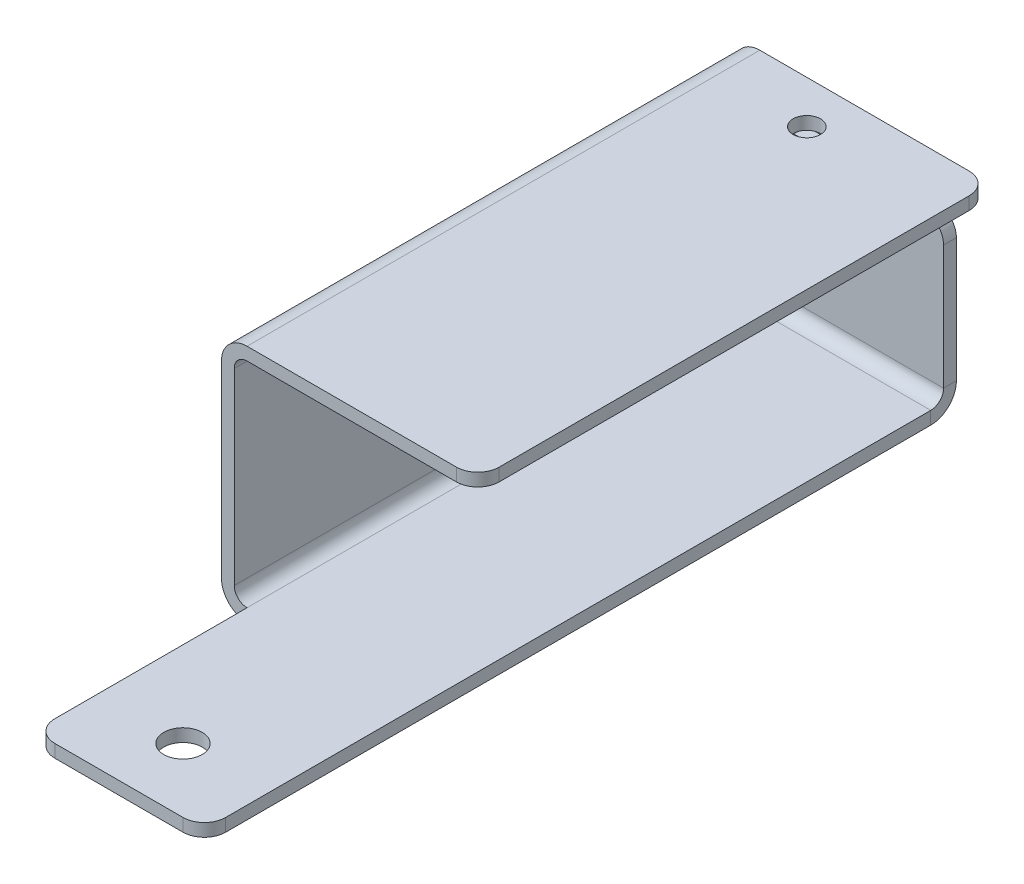
ISO-10303-21;
HEADER;
FILE_DESCRIPTION(('STEP AP214'),'2;1');
FILE_NAME('part.step','',(''),(''),'','','');
FILE_SCHEMA(('AUTOMOTIVE_DESIGN { 1 0 10303 214 1 1 1 1 }'));
ENDSEC;
DATA;
#1=APPLICATION_CONTEXT('core data for automotive mechanical design processes');
#2=APPLICATION_PROTOCOL_DEFINITION('international standard','automotive_design',2000,#1);
#3=PRODUCT_CONTEXT('',#1,'mechanical');
#4=PRODUCT('Part','Part','',(#3));
#5=PRODUCT_RELATED_PRODUCT_CATEGORY('part','',(#4));
#6=PRODUCT_DEFINITION_FORMATION('','',#4);
#7=PRODUCT_DEFINITION_CONTEXT('part definition',#1,'design');
#8=PRODUCT_DEFINITION('design','',#6,#7);
#9=PRODUCT_DEFINITION_SHAPE('','',#8);
#10=(LENGTH_UNIT() NAMED_UNIT(*) SI_UNIT(.MILLI.,.METRE.));
#11=(NAMED_UNIT(*) PLANE_ANGLE_UNIT() SI_UNIT($,.RADIAN.));
#12=(NAMED_UNIT(*) SI_UNIT($,.STERADIAN.) SOLID_ANGLE_UNIT());
#13=UNCERTAINTY_MEASURE_WITH_UNIT(LENGTH_MEASURE(1.E-05),#10,'distance_accuracy_value','');
#14=(GEOMETRIC_REPRESENTATION_CONTEXT(3) GLOBAL_UNCERTAINTY_ASSIGNED_CONTEXT((#13)) GLOBAL_UNIT_ASSIGNED_CONTEXT((#10,
#11,#12)) REPRESENTATION_CONTEXT('',''));
#15=CARTESIAN_POINT('',(0.,0.,0.));
#16=DIRECTION('',(0.,0.,1.));
#17=DIRECTION('',(1.,0.,0.));
#18=AXIS2_PLACEMENT_3D('',#15,#16,#17);
#19=CARTESIAN_POINT('',(-13.,0.,-42.5));
#20=DIRECTION('',(0.,0.,1.));
#21=DIRECTION('',(1.,0.,0.));
#22=AXIS2_PLACEMENT_3D('',#19,#20,#21);
#23=PLANE('',#22);
#24=DIRECTION('',(-1.,0.,0.));
#25=VECTOR('',#24,1.);
#26=CARTESIAN_POINT('',(-11.5000000000001,23.5,-42.5));
#27=LINE('',#26,#25);
#28=CARTESIAN_POINT('',(-11.5000000000001,23.5,-42.5));
#29=VERTEX_POINT('',#28);
#30=CARTESIAN_POINT('',(-13.0000000000001,23.5,-42.5));
#31=VERTEX_POINT('',#30);
#32=EDGE_CURVE('E352',#29,#31,#27,.T.);
#33=ORIENTED_EDGE('',*,*,#32,.F.);
#34=DIRECTION('',(0.,1.,0.));
#35=VECTOR('',#34,1.);
#36=CARTESIAN_POINT('',(-11.5,0.,-42.5));
#37=LINE('',#36,#35);
#38=CARTESIAN_POINT('',(-11.5,1.49999999999999,-42.5));
#39=VERTEX_POINT('',#38);
#40=EDGE_CURVE('E363',#29,#39,#37,.F.);
#41=ORIENTED_EDGE('',*,*,#40,.T.);
#42=DIRECTION('',(1.,0.,0.));
#43=VECTOR('',#42,1.);
#44=CARTESIAN_POINT('',(-13.,1.49999999999999,-42.5));
#45=LINE('',#44,#43);
#46=CARTESIAN_POINT('',(-13.,1.49999999999999,-42.5));
#47=VERTEX_POINT('',#46);
#48=EDGE_CURVE('E358',#39,#47,#45,.F.);
#49=ORIENTED_EDGE('',*,*,#48,.T.);
#50=DIRECTION('',(0.,-1.,0.));
#51=VECTOR('',#50,1.);
#52=CARTESIAN_POINT('',(-13.,0.,-42.5));
#53=LINE('',#52,#51);
#54=EDGE_CURVE('E359',#31,#47,#53,.T.);
#55=ORIENTED_EDGE('',*,*,#54,.F.);
#56=EDGE_LOOP('',(#33,#41,#49,#55));
#57=FACE_BOUND('',#56,.T.);
#58=ADVANCED_FACE('F78',(#57),#23,.F.);
#59=CARTESIAN_POINT('',(-13.,0.,0.));
#60=DIRECTION('',(1.,0.,0.));
#61=DIRECTION('',(0.,1.,0.));
#62=AXIS2_PLACEMENT_3D('',#59,#60,#61);
#63=PLANE('',#62);
#64=DIRECTION('',(0.,0.,1.));
#65=VECTOR('',#64,1.);
#66=CARTESIAN_POINT('',(-13.,1.49999999999999,-42.5));
#67=LINE('',#66,#65);
#68=CARTESIAN_POINT('',(-13.0000000000001,1.5,17.5));
#69=VERTEX_POINT('',#68);
#70=EDGE_CURVE('E365',#69,#47,#67,.F.);
#71=ORIENTED_EDGE('',*,*,#70,.F.);
#72=DIRECTION('',(0.,1.,0.));
#73=VECTOR('',#72,1.);
#74=CARTESIAN_POINT('',(-13.0000000000001,0.,17.5));
#75=LINE('',#74,#73);
#76=CARTESIAN_POINT('',(-13.0000000000001,23.5,17.5));
#77=VERTEX_POINT('',#76);
#78=EDGE_CURVE('E308',#69,#77,#75,.T.);
#79=ORIENTED_EDGE('',*,*,#78,.T.);
#80=DIRECTION('',(0.,0.,1.));
#81=VECTOR('',#80,1.);
#82=CARTESIAN_POINT('',(-13.0000000000001,23.5,42.5));
#83=LINE('',#82,#81);
#84=EDGE_CURVE('E346',#77,#31,#83,.F.);
#85=ORIENTED_EDGE('',*,*,#84,.T.);
#86=ORIENTED_EDGE('',*,*,#54,.T.);
#87=EDGE_LOOP('',(#71,#79,#85,#86));
#88=FACE_BOUND('',#87,.T.);
#89=ADVANCED_FACE('F492',(#88),#63,.F.);
#90=CARTESIAN_POINT('',(-11.5,0.,0.));
#91=DIRECTION('',(1.,0.,0.));
#92=DIRECTION('',(0.,1.,0.));
#93=AXIS2_PLACEMENT_3D('',#90,#91,#92);
#94=PLANE('',#93);
#95=DIRECTION('',(0.,1.,0.));
#96=VECTOR('',#95,1.);
#97=CARTESIAN_POINT('',(-11.5,0.,17.5));
#98=LINE('',#97,#96);
#99=CARTESIAN_POINT('',(-11.5,1.49999999999999,17.5));
#100=VERTEX_POINT('',#99);
#101=CARTESIAN_POINT('',(-11.5000000000001,23.5,17.5));
#102=VERTEX_POINT('',#101);
#103=EDGE_CURVE('E318',#100,#102,#98,.T.);
#104=ORIENTED_EDGE('',*,*,#103,.F.);
#105=DIRECTION('',(0.,0.,1.));
#106=VECTOR('',#105,1.);
#107=CARTESIAN_POINT('',(-11.5,1.49999999999999,-42.5));
#108=LINE('',#107,#106);
#109=EDGE_CURVE('E367',#39,#100,#108,.T.);
#110=ORIENTED_EDGE('',*,*,#109,.F.);
#111=ORIENTED_EDGE('',*,*,#40,.F.);
#112=DIRECTION('',(0.,0.,1.));
#113=VECTOR('',#112,1.);
#114=CARTESIAN_POINT('',(-11.5000000000001,23.5,42.5));
#115=LINE('',#114,#113);
#116=EDGE_CURVE('E343',#102,#29,#115,.F.);
#117=ORIENTED_EDGE('',*,*,#116,.F.);
#118=EDGE_LOOP('',(#104,#110,#111,#117));
#119=FACE_BOUND('',#118,.T.);
#120=ADVANCED_FACE('F477',(#119),#94,.T.);
#121=CARTESIAN_POINT('',(10.,-1.5,42.5));
#122=DIRECTION('',(1.,0.,0.));
#123=DIRECTION('',(0.,0.,-1.));
#124=AXIS2_PLACEMENT_3D('',#121,#122,#123);
#125=PLANE('',#124);
#126=DIRECTION('',(0.,0.,-1.));
#127=VECTOR('',#126,1.);
#128=CARTESIAN_POINT('',(10.,0.,42.5));
#129=LINE('',#128,#127);
#130=CARTESIAN_POINT('',(10.,0.,40.));
#131=VERTEX_POINT('',#130);
#132=CARTESIAN_POINT('',(10.,0.,-42.5));
#133=VERTEX_POINT('',#132);
#134=EDGE_CURVE('E394',#131,#133,#129,.T.);
#135=ORIENTED_EDGE('',*,*,#134,.F.);
#136=DIRECTION('',(0.,1.,0.));
#137=VECTOR('',#136,1.);
#138=CARTESIAN_POINT('',(10.,-1.5,40.));
#139=LINE('',#138,#137);
#140=CARTESIAN_POINT('',(10.,-1.5,40.));
#141=VERTEX_POINT('',#140);
#142=EDGE_CURVE('E417',#131,#141,#139,.F.);
#143=ORIENTED_EDGE('',*,*,#142,.T.);
#144=DIRECTION('',(0.,0.,-1.));
#145=VECTOR('',#144,1.);
#146=CARTESIAN_POINT('',(10.,-1.5,42.5));
#147=LINE('',#146,#145);
#148=CARTESIAN_POINT('',(10.,-1.5,-42.5));
#149=VERTEX_POINT('',#148);
#150=EDGE_CURVE('E385',#141,#149,#147,.T.);
#151=ORIENTED_EDGE('',*,*,#150,.T.);
#152=DIRECTION('',(0.,1.,0.));
#153=VECTOR('',#152,1.);
#154=CARTESIAN_POINT('',(10.,-1.5,-42.5));
#155=LINE('',#154,#153);
#156=EDGE_CURVE('E388',#149,#133,#155,.T.);
#157=ORIENTED_EDGE('',*,*,#156,.T.);
#158=EDGE_LOOP('',(#135,#143,#151,#157));
#159=FACE_BOUND('',#158,.T.);
#160=ADVANCED_FACE('F541',(#159),#125,.T.);
#161=CARTESIAN_POINT('',(10.,-1.5,42.5));
#162=DIRECTION('',(0.,0.,1.));
#163=DIRECTION('',(1.,0.,0.));
#164=AXIS2_PLACEMENT_3D('',#161,#162,#163);
#165=PLANE('',#164);
#166=DIRECTION('',(1.,0.,0.));
#167=VECTOR('',#166,1.);
#168=CARTESIAN_POINT('',(10.,0.,42.5));
#169=LINE('',#168,#167);
#170=CARTESIAN_POINT('',(-7.5,0.,42.5));
#171=VERTEX_POINT('',#170);
#172=CARTESIAN_POINT('',(7.5,0.,42.5));
#173=VERTEX_POINT('',#172);
#174=EDGE_CURVE('E391',#171,#173,#169,.T.);
#175=ORIENTED_EDGE('',*,*,#174,.F.);
#176=DIRECTION('',(0.,1.,0.));
#177=VECTOR('',#176,1.);
#178=CARTESIAN_POINT('',(-7.5,-1.5,42.5));
#179=LINE('',#178,#177);
#180=CARTESIAN_POINT('',(-7.5,-1.5,42.5));
#181=VERTEX_POINT('',#180);
#182=EDGE_CURVE('E411',#171,#181,#179,.F.);
#183=ORIENTED_EDGE('',*,*,#182,.T.);
#184=DIRECTION('',(1.,0.,0.));
#185=VECTOR('',#184,1.);
#186=CARTESIAN_POINT('',(10.,-1.5,42.5));
#187=LINE('',#186,#185);
#188=CARTESIAN_POINT('',(7.5,-1.5,42.5));
#189=VERTEX_POINT('',#188);
#190=EDGE_CURVE('E381',#181,#189,#187,.T.);
#191=ORIENTED_EDGE('',*,*,#190,.T.);
#192=DIRECTION('',(0.,1.,0.));
#193=VECTOR('',#192,1.);
#194=CARTESIAN_POINT('',(7.5,-1.5,42.5));
#195=LINE('',#194,#193);
#196=EDGE_CURVE('E408',#189,#173,#195,.T.);
#197=ORIENTED_EDGE('',*,*,#196,.T.);
#198=EDGE_LOOP('',(#175,#183,#191,#197));
#199=FACE_BOUND('',#198,.T.);
#200=ADVANCED_FACE('F553',(#199),#165,.T.);
#201=CARTESIAN_POINT('',(0.,-1.5,0.));
#202=DIRECTION('',(0.,1.,0.));
#203=DIRECTION('',(0.,0.,1.));
#204=AXIS2_PLACEMENT_3D('',#201,#202,#203);
#205=PLANE('',#204);
#206=CARTESIAN_POINT('',(0.,-1.5,35.));
#207=DIRECTION('',(0.,1.,0.));
#208=DIRECTION('',(0.,0.,1.));
#209=AXIS2_PLACEMENT_3D('',#206,#207,#208);
#210=CIRCLE('',#209,2.25);
#211=CARTESIAN_POINT('',(0.,-1.5,37.25));
#212=VERTEX_POINT('',#211);
#213=EDGE_CURVE('E296',#212,#212,#210,.T.);
#214=ORIENTED_EDGE('',*,*,#213,.T.);
#215=EDGE_LOOP('',(#214));
#216=FACE_BOUND('',#215,.T.);
#217=ORIENTED_EDGE('',*,*,#190,.F.);
#218=CARTESIAN_POINT('',(-7.5,-1.5,40.));
#219=DIRECTION('',(0.,1.,0.));
#220=DIRECTION('',(0.,0.,1.));
#221=AXIS2_PLACEMENT_3D('',#218,#219,#220);
#222=CIRCLE('',#221,2.5);
#223=CARTESIAN_POINT('',(-10.,-1.5,40.));
#224=VERTEX_POINT('',#223);
#225=EDGE_CURVE('E415',#181,#224,#222,.F.);
#226=ORIENTED_EDGE('',*,*,#225,.T.);
#227=DIRECTION('',(0.,0.,-1.));
#228=VECTOR('',#227,1.);
#229=CARTESIAN_POINT('',(-10.,-1.5,42.5));
#230=LINE('',#229,#228);
#231=CARTESIAN_POINT('',(-10.,-1.5,17.5));
#232=VERTEX_POINT('',#231);
#233=EDGE_CURVE('E299',#224,#232,#230,.T.);
#234=ORIENTED_EDGE('',*,*,#233,.T.);
#235=DIRECTION('',(0.,0.,1.));
#236=VECTOR('',#235,1.);
#237=CARTESIAN_POINT('',(-10.,-1.5,42.5));
#238=LINE('',#237,#236);
#239=CARTESIAN_POINT('',(-10.,-1.50000000000002,-42.5));
#240=VERTEX_POINT('',#239);
#241=EDGE_CURVE('E378',#240,#232,#238,.T.);
#242=ORIENTED_EDGE('',*,*,#241,.F.);
#243=DIRECTION('',(-1.,0.,0.));
#244=VECTOR('',#243,1.);
#245=CARTESIAN_POINT('',(10.,-1.5,-42.5));
#246=LINE('',#245,#244);
#247=EDGE_CURVE('E243',#149,#240,#246,.T.);
#248=ORIENTED_EDGE('',*,*,#247,.F.);
#249=ORIENTED_EDGE('',*,*,#150,.F.);
#250=CARTESIAN_POINT('',(7.5,-1.5,40.));
#251=DIRECTION('',(0.,1.,0.));
#252=DIRECTION('',(0.,0.,1.));
#253=AXIS2_PLACEMENT_3D('',#250,#251,#252);
#254=CIRCLE('',#253,2.5);
#255=EDGE_CURVE('E413',#141,#189,#254,.F.);
#256=ORIENTED_EDGE('',*,*,#255,.T.);
#257=EDGE_LOOP('',(#217,#226,#234,#242,#248,#249,#256));
#258=FACE_BOUND('',#257,.T.);
#259=ADVANCED_FACE('F547',(#216,#258),#205,.F.);
#260=CARTESIAN_POINT('',(0.,0.,0.));
#261=DIRECTION('',(0.,1.,0.));
#262=DIRECTION('',(0.,0.,1.));
#263=AXIS2_PLACEMENT_3D('',#260,#261,#262);
#264=PLANE('',#263);
#265=CARTESIAN_POINT('',(0.,0.,35.));
#266=DIRECTION('',(0.,1.,0.));
#267=DIRECTION('',(0.,0.,1.));
#268=AXIS2_PLACEMENT_3D('',#265,#266,#267);
#269=CIRCLE('',#268,2.25);
#270=CARTESIAN_POINT('',(0.,0.,37.25));
#271=VERTEX_POINT('',#270);
#272=EDGE_CURVE('E291',#271,#271,#269,.T.);
#273=ORIENTED_EDGE('',*,*,#272,.F.);
#274=EDGE_LOOP('',(#273));
#275=FACE_BOUND('',#274,.T.);
#276=DIRECTION('',(0.,0.,-1.));
#277=VECTOR('',#276,1.);
#278=CARTESIAN_POINT('',(-10.,0.,0.));
#279=LINE('',#278,#277);
#280=CARTESIAN_POINT('',(-10.,0.,40.));
#281=VERTEX_POINT('',#280);
#282=CARTESIAN_POINT('',(-10.,0.,17.5));
#283=VERTEX_POINT('',#282);
#284=EDGE_CURVE('E306',#281,#283,#279,.T.);
#285=ORIENTED_EDGE('',*,*,#284,.F.);
#286=CARTESIAN_POINT('',(-7.5,0.,40.));
#287=DIRECTION('',(0.,1.,0.));
#288=DIRECTION('',(0.,0.,1.));
#289=AXIS2_PLACEMENT_3D('',#286,#287,#288);
#290=CIRCLE('',#289,2.5);
#291=EDGE_CURVE('E406',#281,#171,#290,.T.);
#292=ORIENTED_EDGE('',*,*,#291,.T.);
#293=ORIENTED_EDGE('',*,*,#174,.T.);
#294=CARTESIAN_POINT('',(7.5,0.,40.));
#295=DIRECTION('',(0.,1.,0.));
#296=DIRECTION('',(0.,0.,1.));
#297=AXIS2_PLACEMENT_3D('',#294,#295,#296);
#298=CIRCLE('',#297,2.5);
#299=EDGE_CURVE('E404',#173,#131,#298,.T.);
#300=ORIENTED_EDGE('',*,*,#299,.T.);
#301=ORIENTED_EDGE('',*,*,#134,.T.);
#302=DIRECTION('',(-1.,0.,0.));
#303=VECTOR('',#302,1.);
#304=CARTESIAN_POINT('',(10.,0.,-42.5));
#305=LINE('',#304,#303);
#306=CARTESIAN_POINT('',(-10.,0.,-42.5));
#307=VERTEX_POINT('',#306);
#308=EDGE_CURVE('E382',#133,#307,#305,.T.);
#309=ORIENTED_EDGE('',*,*,#308,.T.);
#310=DIRECTION('',(0.,0.,1.));
#311=VECTOR('',#310,1.);
#312=CARTESIAN_POINT('',(-10.,0.,42.5));
#313=LINE('',#312,#311);
#314=EDGE_CURVE('E375',#307,#283,#313,.T.);
#315=ORIENTED_EDGE('',*,*,#314,.T.);
#316=EDGE_LOOP('',(#285,#292,#293,#300,#301,#309,#315));
#317=FACE_BOUND('',#316,.T.);
#318=ADVANCED_FACE('F505',(#275,#317),#264,.T.);
#319=CARTESIAN_POINT('',(-10.,1.5,-42.5));
#320=DIRECTION('',(0.,0.,-1.));
#321=DIRECTION('',(-1.,0.,0.));
#322=AXIS2_PLACEMENT_3D('',#319,#320,#321);
#323=PLANE('',#322);
#324=ORIENTED_EDGE('',*,*,#48,.F.);
#325=CARTESIAN_POINT('',(-10.,1.5,-42.5));
#326=DIRECTION('',(0.,0.,1.));
#327=DIRECTION('',(1.,0.,0.));
#328=AXIS2_PLACEMENT_3D('',#325,#326,#327);
#329=CIRCLE('',#328,1.5);
#330=EDGE_CURVE('E362',#307,#39,#329,.F.);
#331=ORIENTED_EDGE('',*,*,#330,.F.);
#332=DIRECTION('',(0.,1.,0.));
#333=VECTOR('',#332,1.);
#334=CARTESIAN_POINT('',(-10.,-1.5,-42.5));
#335=LINE('',#334,#333);
#336=EDGE_CURVE('E397',#240,#307,#335,.T.);
#337=ORIENTED_EDGE('',*,*,#336,.F.);
#338=CARTESIAN_POINT('',(-10.,1.5,-42.5));
#339=DIRECTION('',(0.,0.,1.));
#340=DIRECTION('',(1.,0.,0.));
#341=AXIS2_PLACEMENT_3D('',#338,#339,#340);
#342=CIRCLE('',#341,3.);
#343=EDGE_CURVE('E372',#240,#47,#342,.F.);
#344=ORIENTED_EDGE('',*,*,#343,.T.);
#345=EDGE_LOOP('',(#324,#331,#337,#344));
#346=FACE_BOUND('',#345,.T.);
#347=ADVANCED_FACE('F513',(#346),#323,.T.);
#348=CARTESIAN_POINT('',(-10.,1.5,42.5));
#349=DIRECTION('',(0.,0.,1.));
#350=DIRECTION('',(-1.,0.,0.));
#351=AXIS2_PLACEMENT_3D('',#348,#349,#350);
#352=CYLINDRICAL_SURFACE('',#351,3.);
#353=ORIENTED_EDGE('',*,*,#241,.T.);
#354=CARTESIAN_POINT('',(-10.,1.5,17.5));
#355=DIRECTION('',(0.,0.,-1.));
#356=DIRECTION('',(-1.,0.,0.));
#357=AXIS2_PLACEMENT_3D('',#354,#355,#356);
#358=CIRCLE('',#357,3.);
#359=EDGE_CURVE('E325',#69,#232,#358,.F.);
#360=ORIENTED_EDGE('',*,*,#359,.F.);
#361=ORIENTED_EDGE('',*,*,#70,.T.);
#362=ORIENTED_EDGE('',*,*,#343,.F.);
#363=EDGE_LOOP('',(#353,#360,#361,#362));
#364=FACE_BOUND('',#363,.T.);
#365=ADVANCED_FACE('F495',(#364),#352,.T.);
#366=CARTESIAN_POINT('',(-10.,1.5,42.5));
#367=DIRECTION('',(0.,0.,1.));
#368=DIRECTION('',(-1.,0.,0.));
#369=AXIS2_PLACEMENT_3D('',#366,#367,#368);
#370=CYLINDRICAL_SURFACE('',#369,1.5);
#371=ORIENTED_EDGE('',*,*,#109,.T.);
#372=CARTESIAN_POINT('',(-10.,1.5,17.5));
#373=DIRECTION('',(0.,0.,-1.));
#374=DIRECTION('',(-1.,0.,0.));
#375=AXIS2_PLACEMENT_3D('',#372,#373,#374);
#376=CIRCLE('',#375,1.5);
#377=EDGE_CURVE('E320',#100,#283,#376,.F.);
#378=ORIENTED_EDGE('',*,*,#377,.T.);
#379=ORIENTED_EDGE('',*,*,#314,.F.);
#380=ORIENTED_EDGE('',*,*,#330,.T.);
#381=EDGE_LOOP('',(#371,#378,#379,#380));
#382=FACE_BOUND('',#381,.T.);
#383=ADVANCED_FACE('F511',(#382),#370,.F.);
#384=CARTESIAN_POINT('',(-10.0000000000001,23.5,-42.5));
#385=DIRECTION('',(0.,0.,-1.));
#386=DIRECTION('',(-1.,0.,0.));
#387=AXIS2_PLACEMENT_3D('',#384,#385,#386);
#388=PLANE('',#387);
#389=DIRECTION('',(0.,1.,0.));
#390=VECTOR('',#389,1.);
#391=CARTESIAN_POINT('',(-10.0000000000001,25.,-42.5));
#392=LINE('',#391,#390);
#393=CARTESIAN_POINT('',(-10.0000000000001,25.,-42.5));
#394=VERTEX_POINT('',#393);
#395=CARTESIAN_POINT('',(-10.0000000000001,26.5,-42.4999999999999));
#396=VERTEX_POINT('',#395);
#397=EDGE_CURVE('E328',#394,#396,#392,.T.);
#398=ORIENTED_EDGE('',*,*,#397,.F.);
#399=CARTESIAN_POINT('',(-10.0000000000001,23.5,-42.5));
#400=DIRECTION('',(0.,0.,1.));
#401=DIRECTION('',(1.,0.,0.));
#402=AXIS2_PLACEMENT_3D('',#399,#400,#401);
#403=CIRCLE('',#402,1.5);
#404=EDGE_CURVE('E349',#29,#394,#403,.F.);
#405=ORIENTED_EDGE('',*,*,#404,.F.);
#406=ORIENTED_EDGE('',*,*,#32,.T.);
#407=CARTESIAN_POINT('',(-10.0000000000001,23.5,-42.4999999999999));
#408=DIRECTION('',(0.,0.,1.));
#409=DIRECTION('',(1.,0.,0.));
#410=AXIS2_PLACEMENT_3D('',#407,#408,#409);
#411=CIRCLE('',#410,3.);
#412=EDGE_CURVE('E348',#31,#396,#411,.F.);
#413=ORIENTED_EDGE('',*,*,#412,.T.);
#414=EDGE_LOOP('',(#398,#405,#406,#413));
#415=FACE_BOUND('',#414,.T.);
#416=ADVANCED_FACE('F483',(#415),#388,.T.);
#417=CARTESIAN_POINT('',(-10.0000000000001,23.5,42.5));
#418=DIRECTION('',(0.,0.,1.));
#419=DIRECTION('',(0.,1.,0.));
#420=AXIS2_PLACEMENT_3D('',#417,#418,#419);
#421=CYLINDRICAL_SURFACE('',#420,3.);
#422=CARTESIAN_POINT('',(-10.0000000000001,23.5,17.5));
#423=DIRECTION('',(0.,0.,-1.));
#424=DIRECTION('',(-1.,0.,0.));
#425=AXIS2_PLACEMENT_3D('',#422,#423,#424);
#426=CIRCLE('',#425,3.);
#427=CARTESIAN_POINT('',(-10.0000000000001,26.5000000000002,17.5));
#428=VERTEX_POINT('',#427);
#429=EDGE_CURVE('E323',#428,#77,#426,.F.);
#430=ORIENTED_EDGE('',*,*,#429,.F.);
#431=DIRECTION('',(0.,0.,-1.));
#432=VECTOR('',#431,1.);
#433=CARTESIAN_POINT('',(-10.0000000000001,26.5,0.));
#434=LINE('',#433,#432);
#435=EDGE_CURVE('E332',#428,#396,#434,.T.);
#436=ORIENTED_EDGE('',*,*,#435,.T.);
#437=ORIENTED_EDGE('',*,*,#412,.F.);
#438=ORIENTED_EDGE('',*,*,#84,.F.);
#439=EDGE_LOOP('',(#430,#436,#437,#438));
#440=FACE_BOUND('',#439,.T.);
#441=ADVANCED_FACE('F488',(#440),#421,.T.);
#442=CARTESIAN_POINT('',(-10.0000000000001,23.5,42.5));
#443=DIRECTION('',(0.,0.,1.));
#444=DIRECTION('',(0.,1.,0.));
#445=AXIS2_PLACEMENT_3D('',#442,#443,#444);
#446=CYLINDRICAL_SURFACE('',#445,1.5);
#447=DIRECTION('',(0.,0.,1.));
#448=VECTOR('',#447,1.);
#449=CARTESIAN_POINT('',(-10.0000000000001,25.,-42.5));
#450=LINE('',#449,#448);
#451=CARTESIAN_POINT('',(-10.0000000000001,25.,17.5));
#452=VERTEX_POINT('',#451);
#453=EDGE_CURVE('E329',#394,#452,#450,.T.);
#454=ORIENTED_EDGE('',*,*,#453,.T.);
#455=CARTESIAN_POINT('',(-10.0000000000001,23.5,17.5));
#456=DIRECTION('',(0.,0.,-1.));
#457=DIRECTION('',(-1.,0.,0.));
#458=AXIS2_PLACEMENT_3D('',#455,#456,#457);
#459=CIRCLE('',#458,1.5);
#460=EDGE_CURVE('E315',#452,#102,#459,.F.);
#461=ORIENTED_EDGE('',*,*,#460,.T.);
#462=ORIENTED_EDGE('',*,*,#116,.T.);
#463=ORIENTED_EDGE('',*,*,#404,.T.);
#464=EDGE_LOOP('',(#454,#461,#462,#463));
#465=FACE_BOUND('',#464,.T.);
#466=ADVANCED_FACE('F473',(#465),#446,.F.);
#467=CARTESIAN_POINT('',(-11.5000000000001,26.5,-42.5));
#468=DIRECTION('',(0.,0.,1.));
#469=DIRECTION('',(1.,0.,0.));
#470=AXIS2_PLACEMENT_3D('',#467,#468,#469);
#471=PLANE('',#470);
#472=DIRECTION('',(-1.,0.,0.));
#473=VECTOR('',#472,1.);
#474=CARTESIAN_POINT('',(-11.5000000000001,26.5,-42.5));
#475=LINE('',#474,#473);
#476=CARTESIAN_POINT('',(14.4999999999999,26.5000000000002,-42.5));
#477=VERTEX_POINT('',#476);
#478=EDGE_CURVE('E340',#477,#396,#475,.T.);
#479=ORIENTED_EDGE('',*,*,#478,.F.);
#480=DIRECTION('',(0.,-1.,0.));
#481=VECTOR('',#480,1.);
#482=CARTESIAN_POINT('',(14.4999999999999,26.5000000000002,-42.5));
#483=LINE('',#482,#481);
#484=CARTESIAN_POINT('',(14.4999999999999,25.0000000000002,-42.5));
#485=VERTEX_POINT('',#484);
#486=EDGE_CURVE('E436',#477,#485,#483,.T.);
#487=ORIENTED_EDGE('',*,*,#486,.T.);
#488=DIRECTION('',(-1.,0.,0.));
#489=VECTOR('',#488,1.);
#490=CARTESIAN_POINT('',(-11.5000000000001,25.,-42.5));
#491=LINE('',#490,#489);
#492=EDGE_CURVE('E341',#485,#394,#491,.T.);
#493=ORIENTED_EDGE('',*,*,#492,.T.);
#494=ORIENTED_EDGE('',*,*,#397,.T.);
#495=EDGE_LOOP('',(#479,#487,#493,#494));
#496=FACE_BOUND('',#495,.T.);
#497=ADVANCED_FACE('F456',(#496),#471,.F.);
#498=CARTESIAN_POINT('',(-1.83913740033876E-13,26.5000000000001,0.));
#499=DIRECTION('',(0.,-1.,0.));
#500=DIRECTION('',(1.,0.,0.));
#501=AXIS2_PLACEMENT_3D('',#498,#499,#500);
#502=PLANE('',#501);
#503=CARTESIAN_POINT('',(0.499999999999813,26.5000000000001,-37.5));
#504=DIRECTION('',(0.,1.,0.));
#505=DIRECTION('',(-1.,0.,0.));
#506=AXIS2_PLACEMENT_3D('',#503,#504,#505);
#507=CIRCLE('',#506,1.6);
#508=CARTESIAN_POINT('',(-1.10000000000019,26.5000000000001,-37.5));
#509=VERTEX_POINT('',#508);
#510=EDGE_CURVE('E290',#509,#509,#507,.T.);
#511=ORIENTED_EDGE('',*,*,#510,.F.);
#512=EDGE_LOOP('',(#511));
#513=FACE_BOUND('',#512,.T.);
#514=DIRECTION('',(0.,0.,-1.));
#515=VECTOR('',#514,1.);
#516=CARTESIAN_POINT('',(16.9999999999999,26.5000000000002,-42.5));
#517=LINE('',#516,#515);
#518=CARTESIAN_POINT('',(16.9999999999999,26.5000000000002,15.));
#519=VERTEX_POINT('',#518);
#520=CARTESIAN_POINT('',(16.9999999999999,26.5000000000002,-40.));
#521=VERTEX_POINT('',#520);
#522=EDGE_CURVE('E338',#519,#521,#517,.T.);
#523=ORIENTED_EDGE('',*,*,#522,.T.);
#524=CARTESIAN_POINT('',(14.4999999999999,26.5000000000002,-40.));
#525=DIRECTION('',(0.,-1.,0.));
#526=DIRECTION('',(1.,0.,0.));
#527=AXIS2_PLACEMENT_3D('',#524,#525,#526);
#528=CIRCLE('',#527,2.5);
#529=EDGE_CURVE('E86',#521,#477,#528,.F.);
#530=ORIENTED_EDGE('',*,*,#529,.T.);
#531=ORIENTED_EDGE('',*,*,#478,.T.);
#532=ORIENTED_EDGE('',*,*,#435,.F.);
#533=DIRECTION('',(1.,0.,0.));
#534=VECTOR('',#533,1.);
#535=CARTESIAN_POINT('',(-13.0000000000001,26.5000000000002,17.5));
#536=LINE('',#535,#534);
#537=CARTESIAN_POINT('',(14.4999999999999,26.5000000000002,17.5));
#538=VERTEX_POINT('',#537);
#539=EDGE_CURVE('E311',#428,#538,#536,.T.);
#540=ORIENTED_EDGE('',*,*,#539,.T.);
#541=CARTESIAN_POINT('',(14.4999999999999,26.5000000000002,15.));
#542=DIRECTION('',(0.,-1.,0.));
#543=DIRECTION('',(1.,0.,0.));
#544=AXIS2_PLACEMENT_3D('',#541,#542,#543);
#545=CIRCLE('',#544,2.5);
#546=EDGE_CURVE('E447',#538,#519,#545,.F.);
#547=ORIENTED_EDGE('',*,*,#546,.T.);
#548=EDGE_LOOP('',(#523,#530,#531,#532,#540,#547));
#549=FACE_BOUND('',#548,.T.);
#550=ADVANCED_FACE('F451',(#513,#549),#502,.F.);
#551=CARTESIAN_POINT('',(-1.73472347597681E-13,25.0000000000001,0.));
#552=DIRECTION('',(0.,-1.,0.));
#553=DIRECTION('',(1.,0.,0.));
#554=AXIS2_PLACEMENT_3D('',#551,#552,#553);
#555=PLANE('',#554);
#556=CARTESIAN_POINT('',(0.499999999999823,25.0000000000001,-37.5));
#557=DIRECTION('',(0.,-1.,0.));
#558=DIRECTION('',(1.,0.,0.));
#559=AXIS2_PLACEMENT_3D('',#556,#557,#558);
#560=CIRCLE('',#559,1.6);
#561=CARTESIAN_POINT('',(-1.10000000000017,25.0000000000001,-37.5));
#562=VERTEX_POINT('',#561);
#563=EDGE_CURVE('E912',#562,#562,#560,.F.);
#564=ORIENTED_EDGE('',*,*,#563,.T.);
#565=EDGE_LOOP('',(#564));
#566=FACE_BOUND('',#565,.T.);
#567=ORIENTED_EDGE('',*,*,#492,.F.);
#568=CARTESIAN_POINT('',(14.4999999999999,25.0000000000002,-40.));
#569=DIRECTION('',(0.,-1.,0.));
#570=DIRECTION('',(1.,0.,0.));
#571=AXIS2_PLACEMENT_3D('',#568,#569,#570);
#572=CIRCLE('',#571,2.5);
#573=CARTESIAN_POINT('',(16.9999999999999,25.0000000000002,-40.));
#574=VERTEX_POINT('',#573);
#575=EDGE_CURVE('E441',#485,#574,#572,.T.);
#576=ORIENTED_EDGE('',*,*,#575,.T.);
#577=DIRECTION('',(0.,0.,-1.));
#578=VECTOR('',#577,1.);
#579=CARTESIAN_POINT('',(16.9999999999999,25.0000000000002,-42.5));
#580=LINE('',#579,#578);
#581=CARTESIAN_POINT('',(16.9999999999999,25.0000000000002,15.));
#582=VERTEX_POINT('',#581);
#583=EDGE_CURVE('E337',#582,#574,#580,.T.);
#584=ORIENTED_EDGE('',*,*,#583,.F.);
#585=CARTESIAN_POINT('',(14.4999999999999,25.0000000000002,15.));
#586=DIRECTION('',(0.,-1.,0.));
#587=DIRECTION('',(1.,0.,0.));
#588=AXIS2_PLACEMENT_3D('',#585,#586,#587);
#589=CIRCLE('',#588,2.5);
#590=CARTESIAN_POINT('',(14.4999999999999,25.0000000000002,17.5));
#591=VERTEX_POINT('',#590);
#592=EDGE_CURVE('E439',#582,#591,#589,.T.);
#593=ORIENTED_EDGE('',*,*,#592,.T.);
#594=DIRECTION('',(1.,0.,0.));
#595=VECTOR('',#594,1.);
#596=CARTESIAN_POINT('',(-1.73472347597681E-13,25.0000000000001,17.5));
#597=LINE('',#596,#595);
#598=EDGE_CURVE('E313',#452,#591,#597,.T.);
#599=ORIENTED_EDGE('',*,*,#598,.F.);
#600=ORIENTED_EDGE('',*,*,#453,.F.);
#601=EDGE_LOOP('',(#567,#576,#584,#593,#599,#600));
#602=FACE_BOUND('',#601,.T.);
#603=ADVANCED_FACE('F462',(#566,#602),#555,.T.);
#604=CARTESIAN_POINT('',(16.9999999999999,26.5000000000002,-42.5));
#605=DIRECTION('',(-1.,0.,0.));
#606=DIRECTION('',(0.,-1.,0.));
#607=AXIS2_PLACEMENT_3D('',#604,#605,#606);
#608=PLANE('',#607);
#609=ORIENTED_EDGE('',*,*,#583,.T.);
#610=DIRECTION('',(0.,-1.,0.));
#611=VECTOR('',#610,1.);
#612=CARTESIAN_POINT('',(16.9999999999999,26.5000000000002,-40.));
#613=LINE('',#612,#611);
#614=EDGE_CURVE('E99',#574,#521,#613,.F.);
#615=ORIENTED_EDGE('',*,*,#614,.T.);
#616=ORIENTED_EDGE('',*,*,#522,.F.);
#617=DIRECTION('',(0.,-1.,0.));
#618=VECTOR('',#617,1.);
#619=CARTESIAN_POINT('',(16.9999999999999,26.5000000000002,15.));
#620=LINE('',#619,#618);
#621=EDGE_CURVE('E443',#519,#582,#620,.T.);
#622=ORIENTED_EDGE('',*,*,#621,.T.);
#623=EDGE_LOOP('',(#609,#615,#616,#622));
#624=FACE_BOUND('',#623,.T.);
#625=ADVANCED_FACE('F464',(#624),#608,.F.);
#626=CARTESIAN_POINT('',(-13.0000000000001,0.,17.5));
#627=DIRECTION('',(0.,0.,-1.));
#628=DIRECTION('',(-1.,0.,0.));
#629=AXIS2_PLACEMENT_3D('',#626,#627,#628);
#630=PLANE('',#629);
#631=ORIENTED_EDGE('',*,*,#598,.T.);
#632=DIRECTION('',(0.,-1.,0.));
#633=VECTOR('',#632,1.);
#634=CARTESIAN_POINT('',(14.5000000000001,1.91425527996912E-13,17.5));
#635=LINE('',#634,#633);
#636=EDGE_CURVE('E13',#591,#538,#635,.F.);
#637=ORIENTED_EDGE('',*,*,#636,.T.);
#638=ORIENTED_EDGE('',*,*,#539,.F.);
#639=ORIENTED_EDGE('',*,*,#429,.T.);
#640=ORIENTED_EDGE('',*,*,#78,.F.);
#641=ORIENTED_EDGE('',*,*,#359,.T.);
#642=DIRECTION('',(0.,1.,0.));
#643=VECTOR('',#642,1.);
#644=CARTESIAN_POINT('',(-10.,-1.5,17.5));
#645=LINE('',#644,#643);
#646=EDGE_CURVE('E303',#232,#283,#645,.T.);
#647=ORIENTED_EDGE('',*,*,#646,.T.);
#648=ORIENTED_EDGE('',*,*,#377,.F.);
#649=ORIENTED_EDGE('',*,*,#103,.T.);
#650=ORIENTED_EDGE('',*,*,#460,.F.);
#651=EDGE_LOOP('',(#631,#637,#638,#639,#640,#641,#647,#648,#649,#650));
#652=FACE_BOUND('',#651,.T.);
#653=ADVANCED_FACE('F469',(#652),#630,.F.);
#654=CARTESIAN_POINT('',(-10.,-1.5,42.5));
#655=DIRECTION('',(1.,0.,0.));
#656=DIRECTION('',(0.,0.,-1.));
#657=AXIS2_PLACEMENT_3D('',#654,#655,#656);
#658=PLANE('',#657);
#659=ORIENTED_EDGE('',*,*,#233,.F.);
#660=DIRECTION('',(0.,1.,0.));
#661=VECTOR('',#660,1.);
#662=CARTESIAN_POINT('',(-10.,0.,40.));
#663=LINE('',#662,#661);
#664=EDGE_CURVE('E399',#224,#281,#663,.T.);
#665=ORIENTED_EDGE('',*,*,#664,.T.);
#666=ORIENTED_EDGE('',*,*,#284,.T.);
#667=ORIENTED_EDGE('',*,*,#646,.F.);
#668=EDGE_LOOP('',(#659,#665,#666,#667));
#669=FACE_BOUND('',#668,.T.);
#670=ADVANCED_FACE('F501',(#669),#658,.F.);
#671=CARTESIAN_POINT('',(0.,-1.5,35.));
#672=DIRECTION('',(0.,1.,0.));
#673=DIRECTION('',(0.,0.,1.));
#674=AXIS2_PLACEMENT_3D('',#671,#672,#673);
#675=CYLINDRICAL_SURFACE('',#674,2.25);
#676=ORIENTED_EDGE('',*,*,#213,.F.);
#677=EDGE_LOOP('',(#676));
#678=FACE_BOUND('',#677,.T.);
#679=ORIENTED_EDGE('',*,*,#272,.T.);
#680=EDGE_LOOP('',(#679));
#681=FACE_BOUND('',#680,.T.);
#682=ADVANCED_FACE('F674',(#678,#681),#675,.F.);
#683=CARTESIAN_POINT('',(10.,1.49999999999998,-42.5));
#684=DIRECTION('',(1.,0.,0.));
#685=DIRECTION('',(0.,0.,-1.));
#686=AXIS2_PLACEMENT_3D('',#683,#684,#685);
#687=PLANE('',#686);
#688=DIRECTION('',(0.,0.,1.));
#689=VECTOR('',#688,1.);
#690=CARTESIAN_POINT('',(10.,1.5,-45.5));
#691=LINE('',#690,#689);
#692=CARTESIAN_POINT('',(10.,1.49999999999998,-44.));
#693=VERTEX_POINT('',#692);
#694=CARTESIAN_POINT('',(10.,1.49999999999997,-45.5));
#695=VERTEX_POINT('',#694);
#696=EDGE_CURVE('E287',#693,#695,#691,.F.);
#697=ORIENTED_EDGE('',*,*,#696,.F.);
#698=CARTESIAN_POINT('',(10.,1.49999999999998,-42.5));
#699=DIRECTION('',(-1.,0.,0.));
#700=DIRECTION('',(0.,0.,1.));
#701=AXIS2_PLACEMENT_3D('',#698,#699,#700);
#702=CIRCLE('',#701,1.5);
#703=EDGE_CURVE('E247',#133,#693,#702,.F.);
#704=ORIENTED_EDGE('',*,*,#703,.F.);
#705=ORIENTED_EDGE('',*,*,#156,.F.);
#706=CARTESIAN_POINT('',(10.,1.49999999999998,-42.5));
#707=DIRECTION('',(-1.,0.,0.));
#708=DIRECTION('',(0.,0.,1.));
#709=AXIS2_PLACEMENT_3D('',#706,#707,#708);
#710=CIRCLE('',#709,3.);
#711=EDGE_CURVE('E246',#149,#695,#710,.F.);
#712=ORIENTED_EDGE('',*,*,#711,.T.);
#713=EDGE_LOOP('',(#697,#704,#705,#712));
#714=FACE_BOUND('',#713,.T.);
#715=ADVANCED_FACE('F537',(#714),#687,.T.);
#716=CARTESIAN_POINT('',(-10.,1.49999999999998,-42.5));
#717=DIRECTION('',(1.,0.,0.));
#718=DIRECTION('',(0.,0.,-1.));
#719=AXIS2_PLACEMENT_3D('',#716,#717,#718);
#720=PLANE('',#719);
#721=CARTESIAN_POINT('',(-10.,1.49999999999998,-42.5));
#722=DIRECTION('',(-1.,0.,0.));
#723=DIRECTION('',(0.,0.,1.));
#724=AXIS2_PLACEMENT_3D('',#721,#722,#723);
#725=CIRCLE('',#724,1.5);
#726=CARTESIAN_POINT('',(-10.,1.49999999999998,-44.));
#727=VERTEX_POINT('',#726);
#728=EDGE_CURVE('E254',#727,#307,#725,.T.);
#729=ORIENTED_EDGE('',*,*,#728,.F.);
#730=DIRECTION('',(0.,0.,1.));
#731=VECTOR('',#730,1.);
#732=CARTESIAN_POINT('',(-10.,1.49999999999999,-44.));
#733=LINE('',#732,#731);
#734=CARTESIAN_POINT('',(-10.,1.5,-45.5));
#735=VERTEX_POINT('',#734);
#736=EDGE_CURVE('E251',#727,#735,#733,.F.);
#737=ORIENTED_EDGE('',*,*,#736,.T.);
#738=CARTESIAN_POINT('',(-10.,1.49999999999998,-42.5));
#739=DIRECTION('',(-1.,0.,0.));
#740=DIRECTION('',(0.,0.,1.));
#741=AXIS2_PLACEMENT_3D('',#738,#739,#740);
#742=CIRCLE('',#741,3.);
#743=EDGE_CURVE('E235',#735,#240,#742,.T.);
#744=ORIENTED_EDGE('',*,*,#743,.T.);
#745=ORIENTED_EDGE('',*,*,#336,.T.);
#746=EDGE_LOOP('',(#729,#737,#744,#745));
#747=FACE_BOUND('',#746,.T.);
#748=ADVANCED_FACE('F252',(#747),#720,.F.);
#749=CARTESIAN_POINT('',(-10.,1.49999999999998,-42.5));
#750=DIRECTION('',(-1.,0.,0.));
#751=DIRECTION('',(0.,0.,-1.));
#752=AXIS2_PLACEMENT_3D('',#749,#750,#751);
#753=CYLINDRICAL_SURFACE('',#752,3.);
#754=ORIENTED_EDGE('',*,*,#247,.T.);
#755=ORIENTED_EDGE('',*,*,#743,.F.);
#756=DIRECTION('',(-1.,0.,0.));
#757=VECTOR('',#756,1.);
#758=CARTESIAN_POINT('',(10.,1.5,-45.5));
#759=LINE('',#758,#757);
#760=EDGE_CURVE('E240',#735,#695,#759,.F.);
#761=ORIENTED_EDGE('',*,*,#760,.T.);
#762=ORIENTED_EDGE('',*,*,#711,.F.);
#763=EDGE_LOOP('',(#754,#755,#761,#762));
#764=FACE_BOUND('',#763,.T.);
#765=ADVANCED_FACE('F237',(#764),#753,.T.);
#766=CARTESIAN_POINT('',(-10.,1.49999999999998,-42.5));
#767=DIRECTION('',(-1.,0.,0.));
#768=DIRECTION('',(0.,0.,-1.));
#769=AXIS2_PLACEMENT_3D('',#766,#767,#768);
#770=CYLINDRICAL_SURFACE('',#769,1.5);
#771=ORIENTED_EDGE('',*,*,#308,.F.);
#772=ORIENTED_EDGE('',*,*,#703,.T.);
#773=DIRECTION('',(-1.,0.,0.));
#774=VECTOR('',#773,1.);
#775=CARTESIAN_POINT('',(10.,1.49999999999999,-44.));
#776=LINE('',#775,#774);
#777=EDGE_CURVE('E259',#693,#727,#776,.T.);
#778=ORIENTED_EDGE('',*,*,#777,.T.);
#779=ORIENTED_EDGE('',*,*,#728,.T.);
#780=EDGE_LOOP('',(#771,#772,#778,#779));
#781=FACE_BOUND('',#780,.T.);
#782=ADVANCED_FACE('F515',(#781),#770,.F.);
#783=CARTESIAN_POINT('',(10.,0.,-45.5));
#784=DIRECTION('',(-1.,0.,0.));
#785=DIRECTION('',(0.,0.,1.));
#786=AXIS2_PLACEMENT_3D('',#783,#784,#785);
#787=PLANE('',#786);
#788=DIRECTION('',(0.,-1.,0.));
#789=VECTOR('',#788,1.);
#790=CARTESIAN_POINT('',(10.,-1.48703541913374E-13,-45.5));
#791=LINE('',#790,#789);
#792=CARTESIAN_POINT('',(10.,16.,-45.5000000000001));
#793=VERTEX_POINT('',#792);
#794=EDGE_CURVE('E267',#793,#695,#791,.T.);
#795=ORIENTED_EDGE('',*,*,#794,.F.);
#796=DIRECTION('',(0.,0.,1.));
#797=VECTOR('',#796,1.);
#798=CARTESIAN_POINT('',(10.,16.,-45.5000000000001));
#799=LINE('',#798,#797);
#800=CARTESIAN_POINT('',(10.,16.,-44.));
#801=VERTEX_POINT('',#800);
#802=EDGE_CURVE('E433',#793,#801,#799,.T.);
#803=ORIENTED_EDGE('',*,*,#802,.T.);
#804=DIRECTION('',(0.,1.,0.));
#805=VECTOR('',#804,1.);
#806=CARTESIAN_POINT('',(10.,0.,-44.));
#807=LINE('',#806,#805);
#808=EDGE_CURVE('E268',#801,#693,#807,.F.);
#809=ORIENTED_EDGE('',*,*,#808,.T.);
#810=ORIENTED_EDGE('',*,*,#696,.T.);
#811=EDGE_LOOP('',(#795,#803,#809,#810));
#812=FACE_BOUND('',#811,.T.);
#813=ADVANCED_FACE('F534',(#812),#787,.F.);
#814=CARTESIAN_POINT('',(-10.,18.5,-45.5000000000001));
#815=DIRECTION('',(1.,0.,0.));
#816=DIRECTION('',(0.,0.,-1.));
#817=AXIS2_PLACEMENT_3D('',#814,#815,#816);
#818=PLANE('',#817);
#819=DIRECTION('',(0.,-1.,0.));
#820=VECTOR('',#819,1.);
#821=CARTESIAN_POINT('',(-10.,18.5,-44.0000000000001));
#822=LINE('',#821,#820);
#823=CARTESIAN_POINT('',(-10.,16.,-44.));
#824=VERTEX_POINT('',#823);
#825=EDGE_CURVE('E283',#727,#824,#822,.F.);
#826=ORIENTED_EDGE('',*,*,#825,.T.);
#827=DIRECTION('',(0.,0.,1.));
#828=VECTOR('',#827,1.);
#829=CARTESIAN_POINT('',(-10.,16.,-45.5000000000001));
#830=LINE('',#829,#828);
#831=CARTESIAN_POINT('',(-10.,16.,-45.5000000000001));
#832=VERTEX_POINT('',#831);
#833=EDGE_CURVE('E272',#824,#832,#830,.F.);
#834=ORIENTED_EDGE('',*,*,#833,.T.);
#835=DIRECTION('',(0.,1.,0.));
#836=VECTOR('',#835,1.);
#837=CARTESIAN_POINT('',(-10.,-1.48703541913374E-13,-45.5));
#838=LINE('',#837,#836);
#839=EDGE_CURVE('E264',#735,#832,#838,.T.);
#840=ORIENTED_EDGE('',*,*,#839,.F.);
#841=ORIENTED_EDGE('',*,*,#736,.F.);
#842=EDGE_LOOP('',(#826,#834,#840,#841));
#843=FACE_BOUND('',#842,.T.);
#844=ADVANCED_FACE('F270',(#843),#818,.F.);
#845=CARTESIAN_POINT('',(0.,-1.48703541913374E-13,-45.5));
#846=DIRECTION('',(0.,0.,1.));
#847=DIRECTION('',(0.,-1.,0.));
#848=AXIS2_PLACEMENT_3D('',#845,#846,#847);
#849=PLANE('',#848);
#850=ORIENTED_EDGE('',*,*,#839,.T.);
#851=CARTESIAN_POINT('',(-7.5,16.,-45.5000000000001));
#852=DIRECTION('',(0.,0.,1.));
#853=DIRECTION('',(0.,-1.,0.));
#854=AXIS2_PLACEMENT_3D('',#851,#852,#853);
#855=CIRCLE('',#854,2.5);
#856=CARTESIAN_POINT('',(-7.5,18.5,-45.5000000000001));
#857=VERTEX_POINT('',#856);
#858=EDGE_CURVE('E431',#832,#857,#855,.F.);
#859=ORIENTED_EDGE('',*,*,#858,.T.);
#860=DIRECTION('',(1.,0.,0.));
#861=VECTOR('',#860,1.);
#862=CARTESIAN_POINT('',(0.,18.5,-45.5000000000001));
#863=LINE('',#862,#861);
#864=CARTESIAN_POINT('',(7.5,18.5,-45.5000000000001));
#865=VERTEX_POINT('',#864);
#866=EDGE_CURVE('E273',#857,#865,#863,.T.);
#867=ORIENTED_EDGE('',*,*,#866,.T.);
#868=CARTESIAN_POINT('',(7.5,16.,-45.5000000000001));
#869=DIRECTION('',(0.,0.,1.));
#870=DIRECTION('',(0.,-1.,0.));
#871=AXIS2_PLACEMENT_3D('',#868,#869,#870);
#872=CIRCLE('',#871,2.5);
#873=EDGE_CURVE('E429',#865,#793,#872,.F.);
#874=ORIENTED_EDGE('',*,*,#873,.T.);
#875=ORIENTED_EDGE('',*,*,#794,.T.);
#876=ORIENTED_EDGE('',*,*,#760,.F.);
#877=EDGE_LOOP('',(#850,#859,#867,#874,#875,#876));
#878=FACE_BOUND('',#877,.T.);
#879=ADVANCED_FACE('F263',(#878),#849,.F.);
#880=CARTESIAN_POINT('',(0.,-1.43466319905109E-13,-44.));
#881=DIRECTION('',(0.,0.,1.));
#882=DIRECTION('',(0.,-1.,0.));
#883=AXIS2_PLACEMENT_3D('',#880,#881,#882);
#884=PLANE('',#883);
#885=DIRECTION('',(-1.,0.,0.));
#886=VECTOR('',#885,1.);
#887=CARTESIAN_POINT('',(10.,18.5,-44.0000000000001));
#888=LINE('',#887,#886);
#889=CARTESIAN_POINT('',(-7.5,18.5,-44.0000000000001));
#890=VERTEX_POINT('',#889);
#891=CARTESIAN_POINT('',(7.5,18.5,-44.0000000000001));
#892=VERTEX_POINT('',#891);
#893=EDGE_CURVE('E277',#890,#892,#888,.F.);
#894=ORIENTED_EDGE('',*,*,#893,.F.);
#895=CARTESIAN_POINT('',(-7.5,16.,-44.));
#896=DIRECTION('',(0.,0.,1.));
#897=DIRECTION('',(0.,-1.,0.));
#898=AXIS2_PLACEMENT_3D('',#895,#896,#897);
#899=CIRCLE('',#898,2.5);
#900=EDGE_CURVE('E426',#890,#824,#899,.T.);
#901=ORIENTED_EDGE('',*,*,#900,.T.);
#902=ORIENTED_EDGE('',*,*,#825,.F.);
#903=ORIENTED_EDGE('',*,*,#777,.F.);
#904=ORIENTED_EDGE('',*,*,#808,.F.);
#905=CARTESIAN_POINT('',(7.5,16.,-44.));
#906=DIRECTION('',(0.,0.,1.));
#907=DIRECTION('',(0.,-1.,0.));
#908=AXIS2_PLACEMENT_3D('',#905,#906,#907);
#909=CIRCLE('',#908,2.5);
#910=EDGE_CURVE('E424',#801,#892,#909,.T.);
#911=ORIENTED_EDGE('',*,*,#910,.T.);
#912=EDGE_LOOP('',(#894,#901,#902,#903,#904,#911));
#913=FACE_BOUND('',#912,.T.);
#914=ADVANCED_FACE('F521',(#913),#884,.T.);
#915=CARTESIAN_POINT('',(10.,18.5,-45.5000000000001));
#916=DIRECTION('',(0.,-1.,0.));
#917=DIRECTION('',(0.,0.,-1.));
#918=AXIS2_PLACEMENT_3D('',#915,#916,#917);
#919=PLANE('',#918);
#920=ORIENTED_EDGE('',*,*,#866,.F.);
#921=DIRECTION('',(0.,0.,1.));
#922=VECTOR('',#921,1.);
#923=CARTESIAN_POINT('',(-7.5,18.5,-45.5000000000001));
#924=LINE('',#923,#922);
#925=EDGE_CURVE('E421',#857,#890,#924,.T.);
#926=ORIENTED_EDGE('',*,*,#925,.T.);
#927=ORIENTED_EDGE('',*,*,#893,.T.);
#928=DIRECTION('',(0.,0.,1.));
#929=VECTOR('',#928,1.);
#930=CARTESIAN_POINT('',(7.5,18.5,-45.5000000000001));
#931=LINE('',#930,#929);
#932=EDGE_CURVE('E419',#892,#865,#931,.F.);
#933=ORIENTED_EDGE('',*,*,#932,.T.);
#934=EDGE_LOOP('',(#920,#926,#927,#933));
#935=FACE_BOUND('',#934,.T.);
#936=ADVANCED_FACE('F528',(#935),#919,.F.);
#937=CARTESIAN_POINT('',(0.500000000000007,-1.50100000000013,-37.5));
#938=DIRECTION('',(0.,1.,0.));
#939=DIRECTION('',(-1.,0.,0.));
#940=AXIS2_PLACEMENT_3D('',#937,#938,#939);
#941=CYLINDRICAL_SURFACE('',#940,1.6);
#942=CARTESIAN_POINT('',(-1.10000000000017,25.0000000000001,-37.5));
#943=CARTESIAN_POINT('',(-1.10000000000018,25.0156250000001,-37.5));
#944=CARTESIAN_POINT('',(-1.10000000000018,25.0312500000001,-37.5));
#945=CARTESIAN_POINT('',(-1.10000000000018,25.0625000000001,-37.5));
#946=CARTESIAN_POINT('',(-1.10000000000018,25.0781250000001,-37.5));
#947=CARTESIAN_POINT('',(-1.10000000000018,25.1093750000001,-37.5));
#948=CARTESIAN_POINT('',(-1.10000000000018,25.1250000000001,-37.5));
#949=CARTESIAN_POINT('',(-1.10000000000018,25.1562500000001,-37.5));
#950=CARTESIAN_POINT('',(-1.10000000000018,25.1718750000001,-37.5));
#951=CARTESIAN_POINT('',(-1.10000000000018,25.2031250000001,-37.5));
#952=CARTESIAN_POINT('',(-1.10000000000018,25.2187500000001,-37.5));
#953=CARTESIAN_POINT('',(-1.10000000000018,25.2500000000001,-37.5));
#954=CARTESIAN_POINT('',(-1.10000000000018,25.2656250000001,-37.5));
#955=CARTESIAN_POINT('',(-1.10000000000018,25.2968750000001,-37.5));
#956=CARTESIAN_POINT('',(-1.10000000000018,25.3125000000001,-37.5));
#957=CARTESIAN_POINT('',(-1.10000000000018,25.3437500000001,-37.5));
#958=CARTESIAN_POINT('',(-1.10000000000018,25.3593750000001,-37.5));
#959=CARTESIAN_POINT('',(-1.10000000000018,25.3906250000001,-37.5));
#960=CARTESIAN_POINT('',(-1.10000000000018,25.4062500000001,-37.5));
#961=CARTESIAN_POINT('',(-1.10000000000018,25.4375000000001,-37.5));
#962=CARTESIAN_POINT('',(-1.10000000000018,25.4531250000001,-37.5));
#963=CARTESIAN_POINT('',(-1.10000000000018,25.4843750000001,-37.5));
#964=CARTESIAN_POINT('',(-1.10000000000018,25.5000000000001,-37.5));
#965=CARTESIAN_POINT('',(-1.10000000000018,25.5312500000001,-37.5));
#966=CARTESIAN_POINT('',(-1.10000000000018,25.5468750000001,-37.5));
#967=CARTESIAN_POINT('',(-1.10000000000018,25.5781250000001,-37.5));
#968=CARTESIAN_POINT('',(-1.10000000000018,25.5937500000001,-37.5));
#969=CARTESIAN_POINT('',(-1.10000000000018,25.6250000000001,-37.5));
#970=CARTESIAN_POINT('',(-1.10000000000018,25.6406250000001,-37.5));
#971=CARTESIAN_POINT('',(-1.10000000000018,25.6718750000001,-37.5));
#972=CARTESIAN_POINT('',(-1.10000000000018,25.6875000000001,-37.5));
#973=CARTESIAN_POINT('',(-1.10000000000018,25.7187500000001,-37.5));
#974=CARTESIAN_POINT('',(-1.10000000000018,25.7343750000001,-37.5));
#975=CARTESIAN_POINT('',(-1.10000000000018,25.7656250000001,-37.5));
#976=CARTESIAN_POINT('',(-1.10000000000018,25.7812500000001,-37.5));
#977=CARTESIAN_POINT('',(-1.10000000000018,25.8125000000001,-37.5));
#978=CARTESIAN_POINT('',(-1.10000000000018,25.8281250000001,-37.5));
#979=CARTESIAN_POINT('',(-1.10000000000018,25.8593750000001,-37.5));
#980=CARTESIAN_POINT('',(-1.10000000000018,25.8750000000001,-37.5));
#981=CARTESIAN_POINT('',(-1.10000000000018,25.9062500000001,-37.5));
#982=CARTESIAN_POINT('',(-1.10000000000018,25.9218750000001,-37.5));
#983=CARTESIAN_POINT('',(-1.10000000000018,25.9531250000001,-37.5));
#984=CARTESIAN_POINT('',(-1.10000000000018,25.9687500000001,-37.5));
#985=CARTESIAN_POINT('',(-1.10000000000018,26.0000000000001,-37.5));
#986=CARTESIAN_POINT('',(-1.10000000000018,26.0156250000001,-37.5));
#987=CARTESIAN_POINT('',(-1.10000000000018,26.0468750000001,-37.5));
#988=CARTESIAN_POINT('',(-1.10000000000018,26.0625000000001,-37.5));
#989=CARTESIAN_POINT('',(-1.10000000000018,26.0937500000001,-37.5));
#990=CARTESIAN_POINT('',(-1.10000000000018,26.1093750000001,-37.5));
#991=CARTESIAN_POINT('',(-1.10000000000018,26.1406250000001,-37.5));
#992=CARTESIAN_POINT('',(-1.10000000000018,26.1562500000001,-37.5));
#993=CARTESIAN_POINT('',(-1.10000000000018,26.1875000000001,-37.5));
#994=CARTESIAN_POINT('',(-1.10000000000018,26.2031250000001,-37.5));
#995=CARTESIAN_POINT('',(-1.10000000000018,26.2343750000001,-37.5));
#996=CARTESIAN_POINT('',(-1.10000000000018,26.2500000000001,-37.5));
#997=CARTESIAN_POINT('',(-1.10000000000018,26.2812500000001,-37.5));
#998=CARTESIAN_POINT('',(-1.10000000000018,26.2968750000001,-37.5));
#999=CARTESIAN_POINT('',(-1.10000000000018,26.3281250000001,-37.5));
#1000=CARTESIAN_POINT('',(-1.10000000000018,26.3437500000001,-37.5));
#1001=CARTESIAN_POINT('',(-1.10000000000018,26.3750000000001,-37.5));
#1002=CARTESIAN_POINT('',(-1.10000000000018,26.3906250000001,-37.5));
#1003=CARTESIAN_POINT('',(-1.10000000000018,26.4218750000001,-37.5));
#1004=CARTESIAN_POINT('',(-1.10000000000018,26.4375000000001,-37.5));
#1005=CARTESIAN_POINT('',(-1.10000000000019,26.4687500000001,-37.5));
#1006=CARTESIAN_POINT('',(-1.10000000000019,26.4843750000001,-37.5));
#1007=CARTESIAN_POINT('',(-1.10000000000019,26.5000000000001,-37.5));
#1008=B_SPLINE_CURVE_WITH_KNOTS('',3,(#942,#943,#944,#945,#946,#947,#948,#949,#950,#951,#952,
#953,#954,#955,#956,#957,#958,#959,#960,#961,#962,#963,#964,#965,#966,#967,#968,#969,#970,#971,
#972,#973,#974,#975,#976,#977,#978,#979,#980,#981,#982,#983,#984,#985,#986,#987,#988,#989,#990,
#991,#992,#993,#994,#995,#996,#997,#998,#999,#1000,#1001,#1002,#1003,#1004,#1005,#1006,#1007),
.UNSPECIFIED.,.F.,.F.,(4,2,2,2,2,2,2,2,2,2,2,2,2,2,2,2,2,2,2,2,2,2,2,2,2,2,2,2,2,2,2,2,4),(0.,
0.0468750000000018,0.0937500000000001,0.140624999999998,0.1875,0.234375000000002,0.28125,
0.328124999999999,0.375,0.421875000000002,0.46875,0.515624999999999,0.5625,0.609375000000002,
0.656250000000001,0.703124999999999,0.750000000000001,0.796875000000002,0.843750000000001,
0.890624999999999,0.937500000000001,0.984375000000003,1.03125,1.078125,1.125,1.171875,1.21875,
1.265625,1.3125,1.359375,1.40625,1.453125,1.5),.UNSPECIFIED.);
#1009=EDGE_CURVE('BSEAM564',#562,#509,#1008,.T.);
#1010=ORIENTED_EDGE('',*,*,#563,.F.);
#1011=ORIENTED_EDGE('',*,*,#510,.T.);
#1012=ORIENTED_EDGE('',*,*,#1009,.T.);
#1013=ORIENTED_EDGE('',*,*,#1009,.F.);
#1014=EDGE_LOOP('',(#1010,#1012,#1011,#1013));
#1015=FACE_BOUND('',#1014,.T.);
#1016=ADVANCED_FACE('F564',(#1015),#941,.F.);
#1017=CARTESIAN_POINT('',(-7.5,-1.5,40.));
#1018=DIRECTION('',(0.,-1.,0.));
#1019=DIRECTION('',(0.,0.,-1.));
#1020=AXIS2_PLACEMENT_3D('',#1017,#1018,#1019);
#1021=CYLINDRICAL_SURFACE('',#1020,2.5);
#1022=ORIENTED_EDGE('',*,*,#225,.F.);
#1023=ORIENTED_EDGE('',*,*,#182,.F.);
#1024=ORIENTED_EDGE('',*,*,#291,.F.);
#1025=ORIENTED_EDGE('',*,*,#664,.F.);
#1026=EDGE_LOOP('',(#1022,#1023,#1024,#1025));
#1027=FACE_BOUND('',#1026,.T.);
#1028=ADVANCED_FACE('F551',(#1027),#1021,.T.);
#1029=CARTESIAN_POINT('',(7.5,-1.5,40.));
#1030=DIRECTION('',(0.,1.,0.));
#1031=DIRECTION('',(0.,0.,1.));
#1032=AXIS2_PLACEMENT_3D('',#1029,#1030,#1031);
#1033=CYLINDRICAL_SURFACE('',#1032,2.5);
#1034=ORIENTED_EDGE('',*,*,#255,.F.);
#1035=ORIENTED_EDGE('',*,*,#142,.F.);
#1036=ORIENTED_EDGE('',*,*,#299,.F.);
#1037=ORIENTED_EDGE('',*,*,#196,.F.);
#1038=EDGE_LOOP('',(#1034,#1035,#1036,#1037));
#1039=FACE_BOUND('',#1038,.T.);
#1040=ADVANCED_FACE('F556',(#1039),#1033,.T.);
#1041=CARTESIAN_POINT('',(-7.5,16.,-45.5000000000001));
#1042=DIRECTION('',(0.,0.,1.));
#1043=DIRECTION('',(0.,-1.,0.));
#1044=AXIS2_PLACEMENT_3D('',#1041,#1042,#1043);
#1045=CYLINDRICAL_SURFACE('',#1044,2.5);
#1046=ORIENTED_EDGE('',*,*,#858,.F.);
#1047=ORIENTED_EDGE('',*,*,#833,.F.);
#1048=ORIENTED_EDGE('',*,*,#900,.F.);
#1049=ORIENTED_EDGE('',*,*,#925,.F.);
#1050=EDGE_LOOP('',(#1046,#1047,#1048,#1049));
#1051=FACE_BOUND('',#1050,.T.);
#1052=ADVANCED_FACE('F523',(#1051),#1045,.T.);
#1053=CARTESIAN_POINT('',(7.5,16.,-45.5000000000001));
#1054=DIRECTION('',(0.,0.,1.));
#1055=DIRECTION('',(0.,-1.,0.));
#1056=AXIS2_PLACEMENT_3D('',#1053,#1054,#1055);
#1057=CYLINDRICAL_SURFACE('',#1056,2.5);
#1058=ORIENTED_EDGE('',*,*,#873,.F.);
#1059=ORIENTED_EDGE('',*,*,#932,.F.);
#1060=ORIENTED_EDGE('',*,*,#910,.F.);
#1061=ORIENTED_EDGE('',*,*,#802,.F.);
#1062=EDGE_LOOP('',(#1058,#1059,#1060,#1061));
#1063=FACE_BOUND('',#1062,.T.);
#1064=ADVANCED_FACE('F531',(#1063),#1057,.T.);
#1065=CARTESIAN_POINT('',(14.4999999999999,26.5000000000002,-40.));
#1066=DIRECTION('',(0.,-1.,0.));
#1067=DIRECTION('',(1.,0.,0.));
#1068=AXIS2_PLACEMENT_3D('',#1065,#1066,#1067);
#1069=CYLINDRICAL_SURFACE('',#1068,2.5);
#1070=ORIENTED_EDGE('',*,*,#529,.F.);
#1071=ORIENTED_EDGE('',*,*,#614,.F.);
#1072=ORIENTED_EDGE('',*,*,#575,.F.);
#1073=ORIENTED_EDGE('',*,*,#486,.F.);
#1074=EDGE_LOOP('',(#1070,#1071,#1072,#1073));
#1075=FACE_BOUND('',#1074,.T.);
#1076=ADVANCED_FACE('F459',(#1075),#1069,.T.);
#1077=CARTESIAN_POINT('',(14.4999999999999,26.5000000000002,15.));
#1078=DIRECTION('',(0.,-1.,0.));
#1079=DIRECTION('',(1.,0.,0.));
#1080=AXIS2_PLACEMENT_3D('',#1077,#1078,#1079);
#1081=CYLINDRICAL_SURFACE('',#1080,2.5);
#1082=ORIENTED_EDGE('',*,*,#546,.F.);
#1083=ORIENTED_EDGE('',*,*,#636,.F.);
#1084=ORIENTED_EDGE('',*,*,#592,.F.);
#1085=ORIENTED_EDGE('',*,*,#621,.F.);
#1086=EDGE_LOOP('',(#1082,#1083,#1084,#1085));
#1087=FACE_BOUND('',#1086,.T.);
#1088=ADVANCED_FACE('F80',(#1087),#1081,.T.);
#1089=CLOSED_SHELL('',(#58,#89,#120,#160,#200,#259,#318,#347,#365,#383,#416,#441,#466,#497,#550,
#603,#625,#653,#670,#682,#715,#748,#765,#782,#813,#844,#879,#914,#936,#1016,#1028,#1040,#1052,
#1064,#1076,#1088));
#1090=MANIFOLD_SOLID_BREP('B2',#1089);
#1091=ADVANCED_BREP_SHAPE_REPRESENTATION('',(#18,#1090),#14);
#1092=SHAPE_DEFINITION_REPRESENTATION(#9,#1091);
ENDSEC;
END-ISO-10303-21;
